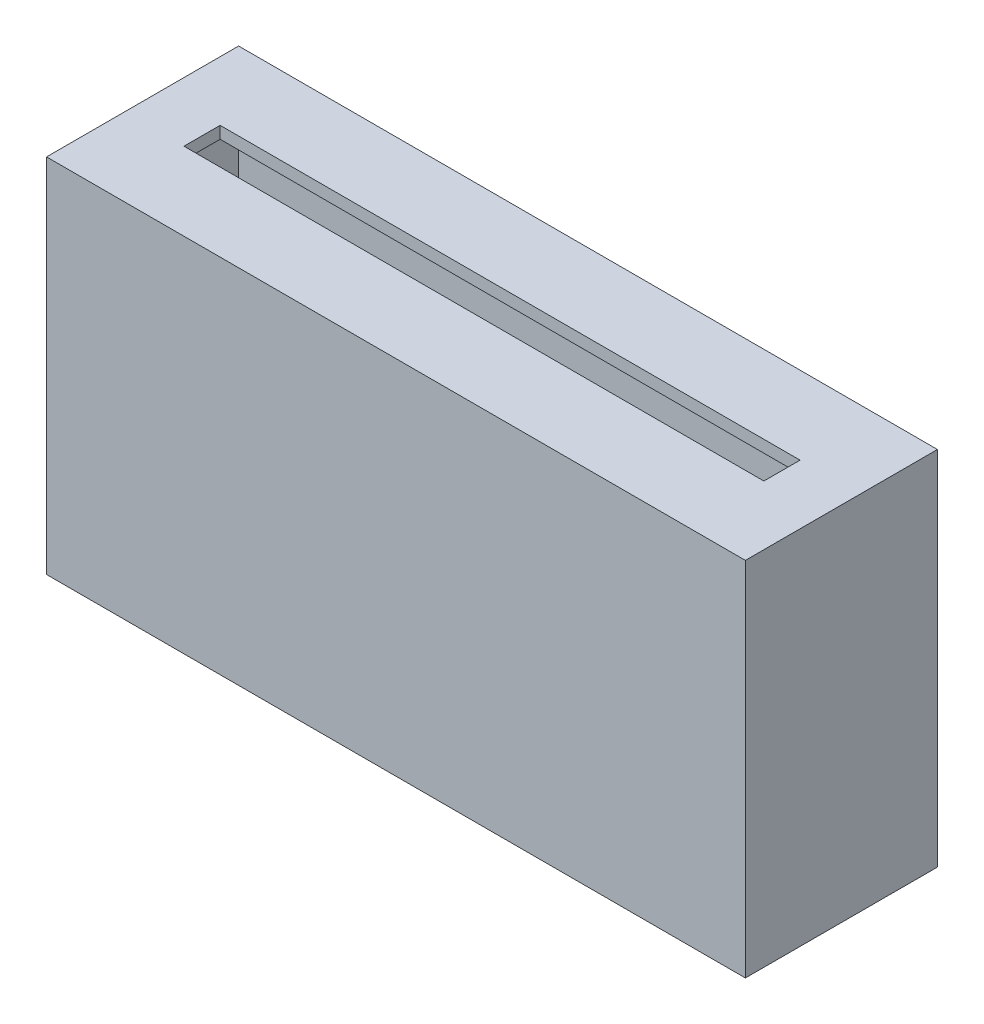
ISO-10303-21;
HEADER;
FILE_DESCRIPTION(('STEP AP214'),'2;1');
FILE_NAME('part.step','',(''),(''),'','','');
FILE_SCHEMA(('AUTOMOTIVE_DESIGN { 1 0 10303 214 1 1 1 1 }'));
ENDSEC;
DATA;
#1=APPLICATION_CONTEXT('core data for automotive mechanical design processes');
#2=APPLICATION_PROTOCOL_DEFINITION('international standard','automotive_design',2000,#1);
#3=PRODUCT_CONTEXT('',#1,'mechanical');
#4=PRODUCT('Part','Part','',(#3));
#5=PRODUCT_RELATED_PRODUCT_CATEGORY('part','',(#4));
#6=PRODUCT_DEFINITION_FORMATION('','',#4);
#7=PRODUCT_DEFINITION_CONTEXT('part definition',#1,'design');
#8=PRODUCT_DEFINITION('design','',#6,#7);
#9=PRODUCT_DEFINITION_SHAPE('','',#8);
#10=(LENGTH_UNIT() NAMED_UNIT(*) SI_UNIT(.MILLI.,.METRE.));
#11=(NAMED_UNIT(*) PLANE_ANGLE_UNIT() SI_UNIT($,.RADIAN.));
#12=(NAMED_UNIT(*) SI_UNIT($,.STERADIAN.) SOLID_ANGLE_UNIT());
#13=UNCERTAINTY_MEASURE_WITH_UNIT(LENGTH_MEASURE(1.E-05),#10,'distance_accuracy_value','');
#14=(GEOMETRIC_REPRESENTATION_CONTEXT(3) GLOBAL_UNCERTAINTY_ASSIGNED_CONTEXT((#13)) GLOBAL_UNIT_ASSIGNED_CONTEXT((#10,
#11,#12)) REPRESENTATION_CONTEXT('',''));
#15=CARTESIAN_POINT('',(0.,0.,0.));
#16=DIRECTION('',(0.,0.,1.));
#17=DIRECTION('',(1.,0.,0.));
#18=AXIS2_PLACEMENT_3D('',#15,#16,#17);
#19=CARTESIAN_POINT('',(0.,0.,0.));
#20=DIRECTION('',(0.,-1.,0.));
#21=DIRECTION('',(0.,0.,-1.));
#22=AXIS2_PLACEMENT_3D('',#19,#20,#21);
#23=PLANE('',#22);
#24=DIRECTION('',(0.,0.,-1.));
#25=VECTOR('',#24,1.);
#26=CARTESIAN_POINT('',(73.614348564585,0.,20.2317580492071));
#27=LINE('',#26,#25);
#28=CARTESIAN_POINT('',(73.614348564585,0.,20.2317580492071));
#29=VERTEX_POINT('',#28);
#30=CARTESIAN_POINT('',(73.614348564585,0.,-20.2317580492071));
#31=VERTEX_POINT('',#30);
#32=EDGE_CURVE('E162',#29,#31,#27,.T.);
#33=ORIENTED_EDGE('',*,*,#32,.F.);
#34=DIRECTION('',(1.,0.,0.));
#35=VECTOR('',#34,1.);
#36=CARTESIAN_POINT('',(-73.614348564585,0.,20.2317580492071));
#37=LINE('',#36,#35);
#38=CARTESIAN_POINT('',(-73.614348564585,0.,20.2317580492071));
#39=VERTEX_POINT('',#38);
#40=EDGE_CURVE('E194',#39,#29,#37,.T.);
#41=ORIENTED_EDGE('',*,*,#40,.F.);
#42=DIRECTION('',(0.,0.,1.));
#43=VECTOR('',#42,1.);
#44=CARTESIAN_POINT('',(-73.614348564585,0.,20.2317580492071));
#45=LINE('',#44,#43);
#46=CARTESIAN_POINT('',(-73.614348564585,0.,-20.2317580492071));
#47=VERTEX_POINT('',#46);
#48=EDGE_CURVE('E205',#47,#39,#45,.T.);
#49=ORIENTED_EDGE('',*,*,#48,.F.);
#50=DIRECTION('',(-1.,0.,0.));
#51=VECTOR('',#50,1.);
#52=CARTESIAN_POINT('',(-73.614348564585,0.,-20.2317580492071));
#53=LINE('',#52,#51);
#54=EDGE_CURVE('E203',#31,#47,#53,.T.);
#55=ORIENTED_EDGE('',*,*,#54,.F.);
#56=EDGE_LOOP('',(#33,#41,#49,#55));
#57=FACE_BOUND('',#56,.T.);
#58=DIRECTION('',(1.,0.,0.));
#59=VECTOR('',#58,1.);
#60=CARTESIAN_POINT('',(0.,0.,17.6917580492071));
#61=LINE('',#60,#59);
#62=CARTESIAN_POINT('',(-71.074348564585,0.,17.6917580492071));
#63=VERTEX_POINT('',#62);
#64=CARTESIAN_POINT('',(71.074348564585,0.,17.6917580492071));
#65=VERTEX_POINT('',#64);
#66=EDGE_CURVE('E168',#63,#65,#61,.T.);
#67=ORIENTED_EDGE('',*,*,#66,.T.);
#68=DIRECTION('',(0.,0.,-1.));
#69=VECTOR('',#68,1.);
#70=CARTESIAN_POINT('',(71.074348564585,0.,0.));
#71=LINE('',#70,#69);
#72=CARTESIAN_POINT('',(71.074348564585,0.,-17.6917580492071));
#73=VERTEX_POINT('',#72);
#74=EDGE_CURVE('E155',#65,#73,#71,.T.);
#75=ORIENTED_EDGE('',*,*,#74,.T.);
#76=DIRECTION('',(-1.,0.,0.));
#77=VECTOR('',#76,1.);
#78=CARTESIAN_POINT('',(0.,0.,-17.6917580492071));
#79=LINE('',#78,#77);
#80=CARTESIAN_POINT('',(-71.074348564585,0.,-17.6917580492071));
#81=VERTEX_POINT('',#80);
#82=EDGE_CURVE('E182',#73,#81,#79,.T.);
#83=ORIENTED_EDGE('',*,*,#82,.T.);
#84=DIRECTION('',(0.,0.,1.));
#85=VECTOR('',#84,1.);
#86=CARTESIAN_POINT('',(-71.074348564585,0.,0.));
#87=LINE('',#86,#85);
#88=EDGE_CURVE('E185',#81,#63,#87,.T.);
#89=ORIENTED_EDGE('',*,*,#88,.T.);
#90=EDGE_LOOP('',(#67,#75,#83,#89));
#91=FACE_BOUND('',#90,.T.);
#92=ADVANCED_FACE('F33',(#57,#91),#23,.T.);
#93=CARTESIAN_POINT('',(73.614348564585,76.2,20.2317580492071));
#94=DIRECTION('',(-1.,0.,0.));
#95=DIRECTION('',(0.,0.,1.));
#96=AXIS2_PLACEMENT_3D('',#93,#94,#95);
#97=PLANE('',#96);
#98=ORIENTED_EDGE('',*,*,#32,.T.);
#99=DIRECTION('',(0.,-1.,0.));
#100=VECTOR('',#99,1.);
#101=CARTESIAN_POINT('',(73.614348564585,76.2,-20.2317580492071));
#102=LINE('',#101,#100);
#103=CARTESIAN_POINT('',(73.614348564585,76.2,-20.2317580492071));
#104=VERTEX_POINT('',#103);
#105=EDGE_CURVE('E11',#104,#31,#102,.T.);
#106=ORIENTED_EDGE('',*,*,#105,.F.);
#107=DIRECTION('',(0.,0.,-1.));
#108=VECTOR('',#107,1.);
#109=CARTESIAN_POINT('',(73.614348564585,76.2,20.2317580492071));
#110=LINE('',#109,#108);
#111=CARTESIAN_POINT('',(73.614348564585,76.2,20.2317580492071));
#112=VERTEX_POINT('',#111);
#113=EDGE_CURVE('E190',#112,#104,#110,.T.);
#114=ORIENTED_EDGE('',*,*,#113,.F.);
#115=DIRECTION('',(0.,-1.,0.));
#116=VECTOR('',#115,1.);
#117=CARTESIAN_POINT('',(73.614348564585,76.2,20.2317580492071));
#118=LINE('',#117,#116);
#119=EDGE_CURVE('E200',#112,#29,#118,.T.);
#120=ORIENTED_EDGE('',*,*,#119,.T.);
#121=EDGE_LOOP('',(#98,#106,#114,#120));
#122=FACE_BOUND('',#121,.T.);
#123=ADVANCED_FACE('F35',(#122),#97,.F.);
#124=CARTESIAN_POINT('',(-73.614348564585,76.2,-20.2317580492071));
#125=DIRECTION('',(0.,0.,1.));
#126=DIRECTION('',(1.,0.,0.));
#127=AXIS2_PLACEMENT_3D('',#124,#125,#126);
#128=PLANE('',#127);
#129=ORIENTED_EDGE('',*,*,#54,.T.);
#130=DIRECTION('',(0.,-1.,0.));
#131=VECTOR('',#130,1.);
#132=CARTESIAN_POINT('',(-73.614348564585,76.2,-20.2317580492071));
#133=LINE('',#132,#131);
#134=CARTESIAN_POINT('',(-73.614348564585,76.2,-20.2317580492071));
#135=VERTEX_POINT('',#134);
#136=EDGE_CURVE('E41',#135,#47,#133,.T.);
#137=ORIENTED_EDGE('',*,*,#136,.F.);
#138=DIRECTION('',(-1.,0.,0.));
#139=VECTOR('',#138,1.);
#140=CARTESIAN_POINT('',(-73.614348564585,76.2,-20.2317580492071));
#141=LINE('',#140,#139);
#142=EDGE_CURVE('E193',#104,#135,#141,.T.);
#143=ORIENTED_EDGE('',*,*,#142,.F.);
#144=ORIENTED_EDGE('',*,*,#105,.T.);
#145=EDGE_LOOP('',(#129,#137,#143,#144));
#146=FACE_BOUND('',#145,.T.);
#147=ADVANCED_FACE('F233',(#146),#128,.F.);
#148=CARTESIAN_POINT('',(-73.614348564585,76.2,20.2317580492071));
#149=DIRECTION('',(1.,0.,0.));
#150=DIRECTION('',(0.,0.,-1.));
#151=AXIS2_PLACEMENT_3D('',#148,#149,#150);
#152=PLANE('',#151);
#153=ORIENTED_EDGE('',*,*,#48,.T.);
#154=DIRECTION('',(0.,-1.,0.));
#155=VECTOR('',#154,1.);
#156=CARTESIAN_POINT('',(-73.614348564585,76.2,20.2317580492071));
#157=LINE('',#156,#155);
#158=CARTESIAN_POINT('',(-73.614348564585,76.2,20.2317580492071));
#159=VERTEX_POINT('',#158);
#160=EDGE_CURVE('E210',#159,#39,#157,.T.);
#161=ORIENTED_EDGE('',*,*,#160,.F.);
#162=DIRECTION('',(0.,0.,1.));
#163=VECTOR('',#162,1.);
#164=CARTESIAN_POINT('',(-73.614348564585,76.2,20.2317580492071));
#165=LINE('',#164,#163);
#166=EDGE_CURVE('E196',#135,#159,#165,.T.);
#167=ORIENTED_EDGE('',*,*,#166,.F.);
#168=ORIENTED_EDGE('',*,*,#136,.T.);
#169=EDGE_LOOP('',(#153,#161,#167,#168));
#170=FACE_BOUND('',#169,.T.);
#171=ADVANCED_FACE('F217',(#170),#152,.F.);
#172=CARTESIAN_POINT('',(-73.614348564585,76.2,20.2317580492071));
#173=DIRECTION('',(0.,0.,-1.));
#174=DIRECTION('',(-1.,0.,0.));
#175=AXIS2_PLACEMENT_3D('',#172,#173,#174);
#176=PLANE('',#175);
#177=ORIENTED_EDGE('',*,*,#40,.T.);
#178=ORIENTED_EDGE('',*,*,#119,.F.);
#179=DIRECTION('',(1.,0.,0.));
#180=VECTOR('',#179,1.);
#181=CARTESIAN_POINT('',(-73.614348564585,76.2,20.2317580492071));
#182=LINE('',#181,#180);
#183=EDGE_CURVE('E198',#159,#112,#182,.T.);
#184=ORIENTED_EDGE('',*,*,#183,.F.);
#185=ORIENTED_EDGE('',*,*,#160,.T.);
#186=EDGE_LOOP('',(#177,#178,#184,#185));
#187=FACE_BOUND('',#186,.T.);
#188=ADVANCED_FACE('F226',(#187),#176,.F.);
#189=CARTESIAN_POINT('',(0.,76.2,0.));
#190=DIRECTION('',(0.,-1.,0.));
#191=DIRECTION('',(0.,0.,-1.));
#192=AXIS2_PLACEMENT_3D('',#189,#190,#191);
#193=PLANE('',#192);
#194=DIRECTION('',(-1.,0.,0.));
#195=VECTOR('',#194,1.);
#196=CARTESIAN_POINT('',(-61.087,76.2,-3.81));
#197=LINE('',#196,#195);
#198=CARTESIAN_POINT('',(61.087,76.2,-3.81));
#199=VERTEX_POINT('',#198);
#200=CARTESIAN_POINT('',(-61.087,76.2,-3.81));
#201=VERTEX_POINT('',#200);
#202=EDGE_CURVE('E149',#199,#201,#197,.T.);
#203=ORIENTED_EDGE('',*,*,#202,.F.);
#204=DIRECTION('',(0.,0.,-1.));
#205=VECTOR('',#204,1.);
#206=CARTESIAN_POINT('',(61.087,76.2,3.81));
#207=LINE('',#206,#205);
#208=CARTESIAN_POINT('',(61.087,76.2,3.81));
#209=VERTEX_POINT('',#208);
#210=EDGE_CURVE('E48',#209,#199,#207,.T.);
#211=ORIENTED_EDGE('',*,*,#210,.F.);
#212=DIRECTION('',(1.,0.,0.));
#213=VECTOR('',#212,1.);
#214=CARTESIAN_POINT('',(-61.087,76.2,3.81));
#215=LINE('',#214,#213);
#216=CARTESIAN_POINT('',(-61.087,76.2,3.81));
#217=VERTEX_POINT('',#216);
#218=EDGE_CURVE('E140',#217,#209,#215,.T.);
#219=ORIENTED_EDGE('',*,*,#218,.F.);
#220=DIRECTION('',(0.,0.,1.));
#221=VECTOR('',#220,1.);
#222=CARTESIAN_POINT('',(-61.087,76.2,3.81));
#223=LINE('',#222,#221);
#224=EDGE_CURVE('E143',#201,#217,#223,.T.);
#225=ORIENTED_EDGE('',*,*,#224,.F.);
#226=EDGE_LOOP('',(#203,#211,#219,#225));
#227=FACE_BOUND('',#226,.T.);
#228=ORIENTED_EDGE('',*,*,#113,.T.);
#229=ORIENTED_EDGE('',*,*,#142,.T.);
#230=ORIENTED_EDGE('',*,*,#166,.T.);
#231=ORIENTED_EDGE('',*,*,#183,.T.);
#232=EDGE_LOOP('',(#228,#229,#230,#231));
#233=FACE_BOUND('',#232,.T.);
#234=ADVANCED_FACE('F232',(#227,#233),#193,.F.);
#235=CARTESIAN_POINT('',(71.074348564585,76.2,20.2317580492071));
#236=DIRECTION('',(-1.,0.,0.));
#237=DIRECTION('',(0.,0.,1.));
#238=AXIS2_PLACEMENT_3D('',#235,#236,#237);
#239=PLANE('',#238);
#240=ORIENTED_EDGE('',*,*,#74,.F.);
#241=DIRECTION('',(0.,-1.,0.));
#242=VECTOR('',#241,1.);
#243=CARTESIAN_POINT('',(71.074348564585,76.2,17.6917580492071));
#244=LINE('',#243,#242);
#245=CARTESIAN_POINT('',(71.074348564585,73.66,17.6917580492071));
#246=VERTEX_POINT('',#245);
#247=EDGE_CURVE('E169',#246,#65,#244,.T.);
#248=ORIENTED_EDGE('',*,*,#247,.F.);
#249=DIRECTION('',(0.,0.,-1.));
#250=VECTOR('',#249,1.);
#251=CARTESIAN_POINT('',(71.074348564585,73.66,0.));
#252=LINE('',#251,#250);
#253=CARTESIAN_POINT('',(71.074348564585,73.66,-17.6917580492071));
#254=VERTEX_POINT('',#253);
#255=EDGE_CURVE('E164',#246,#254,#252,.T.);
#256=ORIENTED_EDGE('',*,*,#255,.T.);
#257=DIRECTION('',(0.,-1.,0.));
#258=VECTOR('',#257,1.);
#259=CARTESIAN_POINT('',(71.074348564585,76.2,-17.6917580492071));
#260=LINE('',#259,#258);
#261=EDGE_CURVE('E159',#254,#73,#260,.T.);
#262=ORIENTED_EDGE('',*,*,#261,.T.);
#263=EDGE_LOOP('',(#240,#248,#256,#262));
#264=FACE_BOUND('',#263,.T.);
#265=ADVANCED_FACE('F251',(#264),#239,.T.);
#266=CARTESIAN_POINT('',(-73.614348564585,76.2,-17.6917580492071));
#267=DIRECTION('',(0.,0.,1.));
#268=DIRECTION('',(1.,0.,0.));
#269=AXIS2_PLACEMENT_3D('',#266,#267,#268);
#270=PLANE('',#269);
#271=ORIENTED_EDGE('',*,*,#82,.F.);
#272=ORIENTED_EDGE('',*,*,#261,.F.);
#273=DIRECTION('',(-1.,0.,0.));
#274=VECTOR('',#273,1.);
#275=CARTESIAN_POINT('',(0.,73.66,-17.6917580492071));
#276=LINE('',#275,#274);
#277=CARTESIAN_POINT('',(-71.074348564585,73.66,-17.6917580492071));
#278=VERTEX_POINT('',#277);
#279=EDGE_CURVE('E167',#254,#278,#276,.T.);
#280=ORIENTED_EDGE('',*,*,#279,.T.);
#281=DIRECTION('',(0.,-1.,0.));
#282=VECTOR('',#281,1.);
#283=CARTESIAN_POINT('',(-71.074348564585,76.2,-17.6917580492071));
#284=LINE('',#283,#282);
#285=EDGE_CURVE('E163',#278,#81,#284,.T.);
#286=ORIENTED_EDGE('',*,*,#285,.T.);
#287=EDGE_LOOP('',(#271,#272,#280,#286));
#288=FACE_BOUND('',#287,.T.);
#289=ADVANCED_FACE('F256',(#288),#270,.T.);
#290=CARTESIAN_POINT('',(-71.074348564585,76.2,20.2317580492071));
#291=DIRECTION('',(1.,0.,0.));
#292=DIRECTION('',(0.,0.,-1.));
#293=AXIS2_PLACEMENT_3D('',#290,#291,#292);
#294=PLANE('',#293);
#295=ORIENTED_EDGE('',*,*,#88,.F.);
#296=ORIENTED_EDGE('',*,*,#285,.F.);
#297=DIRECTION('',(0.,0.,1.));
#298=VECTOR('',#297,1.);
#299=CARTESIAN_POINT('',(-71.074348564585,73.66,0.));
#300=LINE('',#299,#298);
#301=CARTESIAN_POINT('',(-71.074348564585,73.66,17.6917580492071));
#302=VERTEX_POINT('',#301);
#303=EDGE_CURVE('E176',#278,#302,#300,.T.);
#304=ORIENTED_EDGE('',*,*,#303,.T.);
#305=DIRECTION('',(0.,-1.,0.));
#306=VECTOR('',#305,1.);
#307=CARTESIAN_POINT('',(-71.074348564585,76.2,17.6917580492071));
#308=LINE('',#307,#306);
#309=EDGE_CURVE('E171',#302,#63,#308,.T.);
#310=ORIENTED_EDGE('',*,*,#309,.T.);
#311=EDGE_LOOP('',(#295,#296,#304,#310));
#312=FACE_BOUND('',#311,.T.);
#313=ADVANCED_FACE('F277',(#312),#294,.T.);
#314=CARTESIAN_POINT('',(-73.614348564585,76.2,17.6917580492071));
#315=DIRECTION('',(0.,0.,-1.));
#316=DIRECTION('',(-1.,0.,0.));
#317=AXIS2_PLACEMENT_3D('',#314,#315,#316);
#318=PLANE('',#317);
#319=ORIENTED_EDGE('',*,*,#66,.F.);
#320=ORIENTED_EDGE('',*,*,#309,.F.);
#321=DIRECTION('',(1.,0.,0.));
#322=VECTOR('',#321,1.);
#323=CARTESIAN_POINT('',(0.,73.66,17.6917580492071));
#324=LINE('',#323,#322);
#325=EDGE_CURVE('E172',#302,#246,#324,.T.);
#326=ORIENTED_EDGE('',*,*,#325,.T.);
#327=ORIENTED_EDGE('',*,*,#247,.T.);
#328=EDGE_LOOP('',(#319,#320,#326,#327));
#329=FACE_BOUND('',#328,.T.);
#330=ADVANCED_FACE('F281',(#329),#318,.T.);
#331=CARTESIAN_POINT('',(0.,73.66,0.));
#332=DIRECTION('',(0.,-1.,0.));
#333=DIRECTION('',(0.,0.,-1.));
#334=AXIS2_PLACEMENT_3D('',#331,#332,#333);
#335=PLANE('',#334);
#336=DIRECTION('',(0.,0.,-1.));
#337=VECTOR('',#336,1.);
#338=CARTESIAN_POINT('',(61.087,73.66,3.81));
#339=LINE('',#338,#337);
#340=CARTESIAN_POINT('',(61.087,73.66,3.81));
#341=VERTEX_POINT('',#340);
#342=CARTESIAN_POINT('',(61.087,73.66,-3.81));
#343=VERTEX_POINT('',#342);
#344=EDGE_CURVE('E124',#341,#343,#339,.T.);
#345=ORIENTED_EDGE('',*,*,#344,.T.);
#346=DIRECTION('',(-1.,0.,0.));
#347=VECTOR('',#346,1.);
#348=CARTESIAN_POINT('',(-61.087,73.66,-3.81));
#349=LINE('',#348,#347);
#350=CARTESIAN_POINT('',(-61.087,73.66,-3.81));
#351=VERTEX_POINT('',#350);
#352=EDGE_CURVE('E133',#343,#351,#349,.T.);
#353=ORIENTED_EDGE('',*,*,#352,.T.);
#354=DIRECTION('',(0.,0.,1.));
#355=VECTOR('',#354,1.);
#356=CARTESIAN_POINT('',(-61.087,73.66,3.81));
#357=LINE('',#356,#355);
#358=CARTESIAN_POINT('',(-61.087,73.66,3.81));
#359=VERTEX_POINT('',#358);
#360=EDGE_CURVE('E56',#351,#359,#357,.T.);
#361=ORIENTED_EDGE('',*,*,#360,.T.);
#362=DIRECTION('',(1.,0.,0.));
#363=VECTOR('',#362,1.);
#364=CARTESIAN_POINT('',(-61.087,73.66,3.81));
#365=LINE('',#364,#363);
#366=EDGE_CURVE('E130',#359,#341,#365,.T.);
#367=ORIENTED_EDGE('',*,*,#366,.T.);
#368=EDGE_LOOP('',(#345,#353,#361,#367));
#369=FACE_BOUND('',#368,.T.);
#370=ORIENTED_EDGE('',*,*,#255,.F.);
#371=ORIENTED_EDGE('',*,*,#325,.F.);
#372=ORIENTED_EDGE('',*,*,#303,.F.);
#373=ORIENTED_EDGE('',*,*,#279,.F.);
#374=EDGE_LOOP('',(#370,#371,#372,#373));
#375=FACE_BOUND('',#374,.T.);
#376=ADVANCED_FACE('F137',(#369,#375),#335,.T.);
#377=CARTESIAN_POINT('',(61.087,73.66,3.81));
#378=DIRECTION('',(1.,0.,0.));
#379=DIRECTION('',(0.,0.,-1.));
#380=AXIS2_PLACEMENT_3D('',#377,#378,#379);
#381=PLANE('',#380);
#382=ORIENTED_EDGE('',*,*,#210,.T.);
#383=DIRECTION('',(0.,1.,0.));
#384=VECTOR('',#383,1.);
#385=CARTESIAN_POINT('',(61.087,73.66,-3.81));
#386=LINE('',#385,#384);
#387=EDGE_CURVE('E120',#343,#199,#386,.T.);
#388=ORIENTED_EDGE('',*,*,#387,.F.);
#389=ORIENTED_EDGE('',*,*,#344,.F.);
#390=DIRECTION('',(0.,1.,0.));
#391=VECTOR('',#390,1.);
#392=CARTESIAN_POINT('',(61.087,73.66,3.81));
#393=LINE('',#392,#391);
#394=EDGE_CURVE('E153',#341,#209,#393,.T.);
#395=ORIENTED_EDGE('',*,*,#394,.T.);
#396=EDGE_LOOP('',(#382,#388,#389,#395));
#397=FACE_BOUND('',#396,.T.);
#398=ADVANCED_FACE('F122',(#397),#381,.F.);
#399=CARTESIAN_POINT('',(-61.087,73.66,3.81));
#400=DIRECTION('',(0.,0.,1.));
#401=DIRECTION('',(1.,0.,0.));
#402=AXIS2_PLACEMENT_3D('',#399,#400,#401);
#403=PLANE('',#402);
#404=ORIENTED_EDGE('',*,*,#218,.T.);
#405=ORIENTED_EDGE('',*,*,#394,.F.);
#406=ORIENTED_EDGE('',*,*,#366,.F.);
#407=DIRECTION('',(0.,1.,0.));
#408=VECTOR('',#407,1.);
#409=CARTESIAN_POINT('',(-61.087,73.66,3.81));
#410=LINE('',#409,#408);
#411=EDGE_CURVE('E156',#359,#217,#410,.T.);
#412=ORIENTED_EDGE('',*,*,#411,.T.);
#413=EDGE_LOOP('',(#404,#405,#406,#412));
#414=FACE_BOUND('',#413,.T.);
#415=ADVANCED_FACE('F263',(#414),#403,.F.);
#416=CARTESIAN_POINT('',(-61.087,73.66,3.81));
#417=DIRECTION('',(-1.,0.,0.));
#418=DIRECTION('',(0.,0.,1.));
#419=AXIS2_PLACEMENT_3D('',#416,#417,#418);
#420=PLANE('',#419);
#421=ORIENTED_EDGE('',*,*,#224,.T.);
#422=ORIENTED_EDGE('',*,*,#411,.F.);
#423=ORIENTED_EDGE('',*,*,#360,.F.);
#424=DIRECTION('',(0.,1.,0.));
#425=VECTOR('',#424,1.);
#426=CARTESIAN_POINT('',(-61.087,73.66,-3.81));
#427=LINE('',#426,#425);
#428=EDGE_CURVE('E129',#351,#201,#427,.T.);
#429=ORIENTED_EDGE('',*,*,#428,.T.);
#430=EDGE_LOOP('',(#421,#422,#423,#429));
#431=FACE_BOUND('',#430,.T.);
#432=ADVANCED_FACE('F261',(#431),#420,.F.);
#433=CARTESIAN_POINT('',(-61.087,73.66,-3.81));
#434=DIRECTION('',(0.,0.,-1.));
#435=DIRECTION('',(-1.,0.,0.));
#436=AXIS2_PLACEMENT_3D('',#433,#434,#435);
#437=PLANE('',#436);
#438=ORIENTED_EDGE('',*,*,#202,.T.);
#439=ORIENTED_EDGE('',*,*,#428,.F.);
#440=ORIENTED_EDGE('',*,*,#352,.F.);
#441=ORIENTED_EDGE('',*,*,#387,.T.);
#442=EDGE_LOOP('',(#438,#439,#440,#441));
#443=FACE_BOUND('',#442,.T.);
#444=ADVANCED_FACE('F134',(#443),#437,.F.);
#445=CLOSED_SHELL('',(#92,#123,#147,#171,#188,#234,#265,#289,#313,#330,#376,#398,#415,#432,#444));
#446=MANIFOLD_SOLID_BREP('B2',#445);
#447=ADVANCED_BREP_SHAPE_REPRESENTATION('',(#18,#446),#14);
#448=SHAPE_DEFINITION_REPRESENTATION(#9,#447);
ENDSEC;
END-ISO-10303-21;
